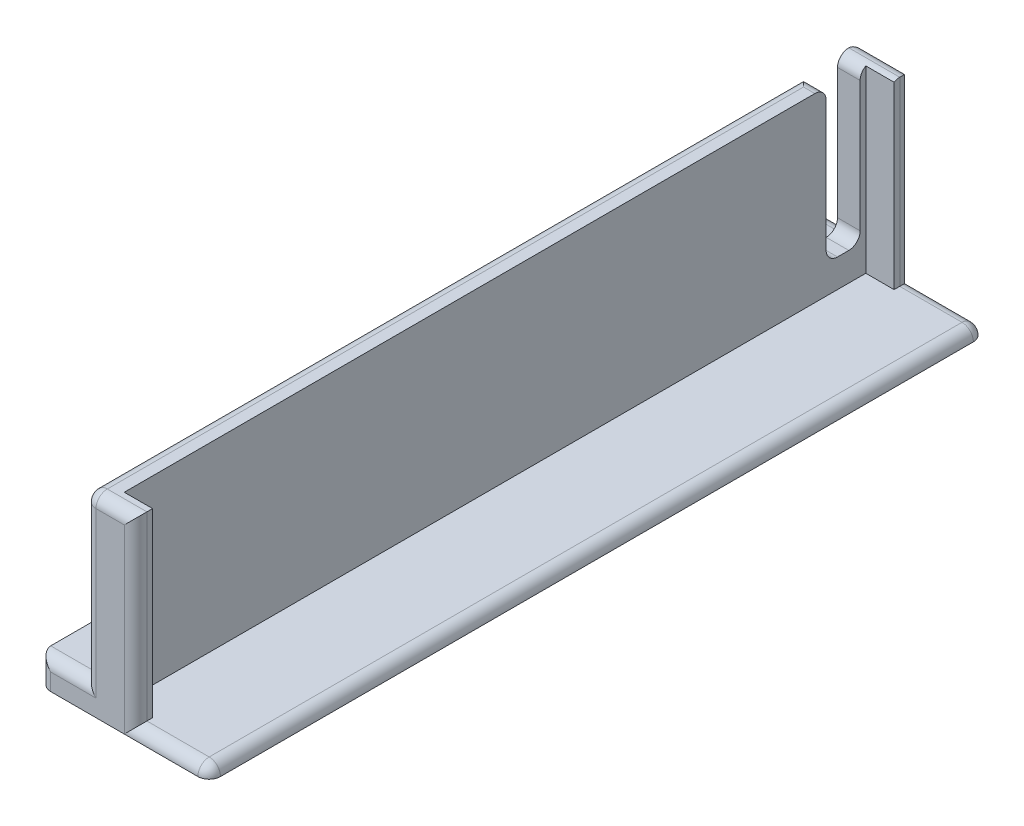
ISO-10303-21;
HEADER;
FILE_DESCRIPTION(('STEP AP214'),'2;1');
FILE_NAME('part.step','',(''),(''),'','','');
FILE_SCHEMA(('AUTOMOTIVE_DESIGN { 1 0 10303 214 1 1 1 1 }'));
ENDSEC;
DATA;
#1=APPLICATION_CONTEXT('core data for automotive mechanical design processes');
#2=APPLICATION_PROTOCOL_DEFINITION('international standard','automotive_design',2000,#1);
#3=PRODUCT_CONTEXT('',#1,'mechanical');
#4=PRODUCT('Part','Part','',(#3));
#5=PRODUCT_RELATED_PRODUCT_CATEGORY('part','',(#4));
#6=PRODUCT_DEFINITION_FORMATION('','',#4);
#7=PRODUCT_DEFINITION_CONTEXT('part definition',#1,'design');
#8=PRODUCT_DEFINITION('design','',#6,#7);
#9=PRODUCT_DEFINITION_SHAPE('','',#8);
#10=(LENGTH_UNIT() NAMED_UNIT(*) SI_UNIT(.MILLI.,.METRE.));
#11=(NAMED_UNIT(*) PLANE_ANGLE_UNIT() SI_UNIT($,.RADIAN.));
#12=(NAMED_UNIT(*) SI_UNIT($,.STERADIAN.) SOLID_ANGLE_UNIT());
#13=UNCERTAINTY_MEASURE_WITH_UNIT(LENGTH_MEASURE(1.E-05),#10,'distance_accuracy_value','');
#14=(GEOMETRIC_REPRESENTATION_CONTEXT(3) GLOBAL_UNCERTAINTY_ASSIGNED_CONTEXT((#13)) GLOBAL_UNIT_ASSIGNED_CONTEXT((#10,
#11,#12)) REPRESENTATION_CONTEXT('',''));
#15=CARTESIAN_POINT('',(0.,0.,0.));
#16=DIRECTION('',(0.,0.,1.));
#17=DIRECTION('',(1.,0.,0.));
#18=AXIS2_PLACEMENT_3D('',#15,#16,#17);
#19=CARTESIAN_POINT('',(12.,34.,131.));
#20=DIRECTION('',(0.,-1.,0.));
#21=DIRECTION('',(0.,0.,-1.));
#22=AXIS2_PLACEMENT_3D('',#19,#20,#21);
#23=PLANE('',#22);
#24=DIRECTION('',(0.,0.,-1.));
#25=VECTOR('',#24,1.);
#26=CARTESIAN_POINT('',(12.,34.,131.));
#27=LINE('',#26,#25);
#28=CARTESIAN_POINT('',(12.,34.,131.));
#29=VERTEX_POINT('',#28);
#30=CARTESIAN_POINT('',(12.,34.,9.00000000000001));
#31=VERTEX_POINT('',#30);
#32=EDGE_CURVE('E265',#29,#31,#27,.T.);
#33=ORIENTED_EDGE('',*,*,#32,.T.);
#34=DIRECTION('',(1.,0.,0.));
#35=VECTOR('',#34,1.);
#36=CARTESIAN_POINT('',(12.,34.,9.00000000000001));
#37=LINE('',#36,#35);
#38=CARTESIAN_POINT('',(10.,34.,9.));
#39=VERTEX_POINT('',#38);
#40=EDGE_CURVE('E331',#31,#39,#37,.F.);
#41=ORIENTED_EDGE('',*,*,#40,.T.);
#42=DIRECTION('',(0.,0.,-1.));
#43=VECTOR('',#42,1.);
#44=CARTESIAN_POINT('',(10.,34.,131.));
#45=LINE('',#44,#43);
#46=CARTESIAN_POINT('',(10.,34.,132.));
#47=VERTEX_POINT('',#46);
#48=EDGE_CURVE('E328',#39,#47,#45,.F.);
#49=ORIENTED_EDGE('',*,*,#48,.T.);
#50=DIRECTION('',(-1.,0.,0.));
#51=VECTOR('',#50,1.);
#52=CARTESIAN_POINT('',(17.,34.,132.));
#53=LINE('',#52,#51);
#54=CARTESIAN_POINT('',(17.,34.,132.));
#55=VERTEX_POINT('',#54);
#56=EDGE_CURVE('E325',#47,#55,#53,.F.);
#57=ORIENTED_EDGE('',*,*,#56,.T.);
#58=DIRECTION('',(0.,0.,-1.));
#59=VECTOR('',#58,1.);
#60=CARTESIAN_POINT('',(17.,34.,134.));
#61=LINE('',#60,#59);
#62=CARTESIAN_POINT('',(17.,34.,131.));
#63=VERTEX_POINT('',#62);
#64=EDGE_CURVE('E520',#55,#63,#61,.T.);
#65=ORIENTED_EDGE('',*,*,#64,.T.);
#66=DIRECTION('',(-1.,0.,0.));
#67=VECTOR('',#66,1.);
#68=CARTESIAN_POINT('',(8.,34.,131.));
#69=LINE('',#68,#67);
#70=EDGE_CURVE('E513',#63,#29,#69,.T.);
#71=ORIENTED_EDGE('',*,*,#70,.T.);
#72=EDGE_LOOP('',(#33,#41,#49,#57,#65,#71));
#73=FACE_BOUND('',#72,.T.);
#74=ADVANCED_FACE('F39',(#73),#23,.F.);
#75=CARTESIAN_POINT('',(0.,5.,131.));
#76=DIRECTION('',(1.,0.,0.));
#77=DIRECTION('',(0.,0.,-1.));
#78=AXIS2_PLACEMENT_3D('',#75,#76,#77);
#79=PLANE('',#78);
#80=DIRECTION('',(0.,0.,-1.));
#81=VECTOR('',#80,1.);
#82=CARTESIAN_POINT('',(0.,5.,131.));
#83=LINE('',#82,#81);
#84=CARTESIAN_POINT('',(0.,5.,132.));
#85=VERTEX_POINT('',#84);
#86=CARTESIAN_POINT('',(0.,5.,-1.));
#87=VERTEX_POINT('',#86);
#88=EDGE_CURVE('E257',#85,#87,#83,.T.);
#89=ORIENTED_EDGE('',*,*,#88,.T.);
#90=DIRECTION('',(0.,1.,0.));
#91=VECTOR('',#90,1.);
#92=CARTESIAN_POINT('',(0.,0.,-1.));
#93=LINE('',#92,#91);
#94=CARTESIAN_POINT('',(0.,0.,-1.));
#95=VERTEX_POINT('',#94);
#96=EDGE_CURVE('E384',#87,#95,#93,.F.);
#97=ORIENTED_EDGE('',*,*,#96,.T.);
#98=DIRECTION('',(0.,0.,-1.));
#99=VECTOR('',#98,1.);
#100=CARTESIAN_POINT('',(0.,0.,131.));
#101=LINE('',#100,#99);
#102=CARTESIAN_POINT('',(0.,0.,132.));
#103=VERTEX_POINT('',#102);
#104=EDGE_CURVE('E274',#103,#95,#101,.T.);
#105=ORIENTED_EDGE('',*,*,#104,.F.);
#106=DIRECTION('',(0.,-1.,0.));
#107=VECTOR('',#106,1.);
#108=CARTESIAN_POINT('',(0.,5.,132.));
#109=LINE('',#108,#107);
#110=EDGE_CURVE('E381',#103,#85,#109,.F.);
#111=ORIENTED_EDGE('',*,*,#110,.T.);
#112=EDGE_LOOP('',(#89,#97,#105,#111));
#113=FACE_BOUND('',#112,.T.);
#114=ADVANCED_FACE('F652',(#113),#79,.F.);
#115=CARTESIAN_POINT('',(0.,0.,131.));
#116=DIRECTION('',(0.,1.,0.));
#117=DIRECTION('',(0.,0.,1.));
#118=AXIS2_PLACEMENT_3D('',#115,#116,#117);
#119=PLANE('',#118);
#120=CARTESIAN_POINT('',(4.,0.,111.));
#121=DIRECTION('',(0.,1.,0.));
#122=DIRECTION('',(0.,0.,1.));
#123=AXIS2_PLACEMENT_3D('',#120,#121,#122);
#124=CIRCLE('',#123,1.7);
#125=CARTESIAN_POINT('',(4.,0.,112.7));
#126=VERTEX_POINT('',#125);
#127=EDGE_CURVE('E534',#126,#126,#124,.T.);
#128=ORIENTED_EDGE('',*,*,#127,.T.);
#129=EDGE_LOOP('',(#128));
#130=FACE_BOUND('',#129,.T.);
#131=CARTESIAN_POINT('',(4.,0.,20.));
#132=DIRECTION('',(0.,1.,0.));
#133=DIRECTION('',(0.,0.,1.));
#134=AXIS2_PLACEMENT_3D('',#131,#132,#133);
#135=CIRCLE('',#134,1.7);
#136=CARTESIAN_POINT('',(4.,0.,21.7));
#137=VERTEX_POINT('',#136);
#138=EDGE_CURVE('E244',#137,#137,#135,.T.);
#139=ORIENTED_EDGE('',*,*,#138,.T.);
#140=EDGE_LOOP('',(#139));
#141=FACE_BOUND('',#140,.T.);
#142=ORIENTED_EDGE('',*,*,#104,.T.);
#143=CARTESIAN_POINT('',(2.,0.,-1.));
#144=DIRECTION('',(0.,1.,0.));
#145=DIRECTION('',(0.,0.,1.));
#146=AXIS2_PLACEMENT_3D('',#143,#144,#145);
#147=CIRCLE('',#146,2.);
#148=CARTESIAN_POINT('',(2.,0.,-3.));
#149=VERTEX_POINT('',#148);
#150=EDGE_CURVE('E395',#95,#149,#147,.F.);
#151=ORIENTED_EDGE('',*,*,#150,.T.);
#152=DIRECTION('',(-1.,0.,0.));
#153=VECTOR('',#152,1.);
#154=CARTESIAN_POINT('',(30.,0.,-3.));
#155=LINE('',#154,#153);
#156=CARTESIAN_POINT('',(15.,0.,-3.));
#157=VERTEX_POINT('',#156);
#158=EDGE_CURVE('E237',#157,#149,#155,.T.);
#159=ORIENTED_EDGE('',*,*,#158,.F.);
#160=CARTESIAN_POINT('',(28.,0.,-3.));
#161=VERTEX_POINT('',#160);
#162=EDGE_CURVE('E227',#161,#157,#155,.T.);
#163=ORIENTED_EDGE('',*,*,#162,.F.);
#164=CARTESIAN_POINT('',(28.,0.,-1.));
#165=DIRECTION('',(0.,1.,0.));
#166=DIRECTION('',(0.,0.,1.));
#167=AXIS2_PLACEMENT_3D('',#164,#165,#166);
#168=CIRCLE('',#167,2.);
#169=CARTESIAN_POINT('',(30.,0.,-1.));
#170=VERTEX_POINT('',#169);
#171=EDGE_CURVE('E57',#161,#170,#168,.F.);
#172=ORIENTED_EDGE('',*,*,#171,.T.);
#173=DIRECTION('',(0.,0.,-1.));
#174=VECTOR('',#173,1.);
#175=CARTESIAN_POINT('',(30.,0.,131.));
#176=LINE('',#175,#174);
#177=CARTESIAN_POINT('',(30.,0.,132.));
#178=VERTEX_POINT('',#177);
#179=EDGE_CURVE('E61',#178,#170,#176,.T.);
#180=ORIENTED_EDGE('',*,*,#179,.F.);
#181=CARTESIAN_POINT('',(28.,0.,132.));
#182=DIRECTION('',(0.,1.,0.));
#183=DIRECTION('',(0.,0.,1.));
#184=AXIS2_PLACEMENT_3D('',#181,#182,#183);
#185=CIRCLE('',#184,2.);
#186=CARTESIAN_POINT('',(28.,0.,134.));
#187=VERTEX_POINT('',#186);
#188=EDGE_CURVE('E387',#178,#187,#185,.F.);
#189=ORIENTED_EDGE('',*,*,#188,.T.);
#190=DIRECTION('',(1.,0.,0.));
#191=VECTOR('',#190,1.);
#192=CARTESIAN_POINT('',(0.,0.,134.));
#193=LINE('',#192,#191);
#194=CARTESIAN_POINT('',(15.,0.,134.));
#195=VERTEX_POINT('',#194);
#196=EDGE_CURVE('E508',#195,#187,#193,.T.);
#197=ORIENTED_EDGE('',*,*,#196,.F.);
#198=CARTESIAN_POINT('',(2.,0.,134.));
#199=VERTEX_POINT('',#198);
#200=EDGE_CURVE('E512',#199,#195,#193,.T.);
#201=ORIENTED_EDGE('',*,*,#200,.F.);
#202=CARTESIAN_POINT('',(2.,0.,132.));
#203=DIRECTION('',(0.,1.,0.));
#204=DIRECTION('',(0.,0.,1.));
#205=AXIS2_PLACEMENT_3D('',#202,#203,#204);
#206=CIRCLE('',#205,2.);
#207=EDGE_CURVE('E392',#199,#103,#206,.F.);
#208=ORIENTED_EDGE('',*,*,#207,.T.);
#209=EDGE_LOOP('',(#142,#151,#159,#163,#172,#180,#189,#197,#201,#208));
#210=FACE_BOUND('',#209,.T.);
#211=ADVANCED_FACE('F654',(#130,#141,#210),#119,.F.);
#212=CARTESIAN_POINT('',(30.,2.,131.));
#213=DIRECTION('',(0.,-1.,0.));
#214=DIRECTION('',(1.,0.,0.));
#215=AXIS2_PLACEMENT_3D('',#212,#213,#214);
#216=PLANE('',#215);
#217=DIRECTION('',(0.,0.,-1.));
#218=VECTOR('',#217,1.);
#219=CARTESIAN_POINT('',(28.,2.,131.));
#220=LINE('',#219,#218);
#221=CARTESIAN_POINT('',(28.,2.,132.));
#222=VERTEX_POINT('',#221);
#223=CARTESIAN_POINT('',(28.,2.,-1.));
#224=VERTEX_POINT('',#223);
#225=EDGE_CURVE('E373',#222,#224,#220,.T.);
#226=ORIENTED_EDGE('',*,*,#225,.T.);
#227=DIRECTION('',(1.,0.,0.));
#228=VECTOR('',#227,1.);
#229=CARTESIAN_POINT('',(17.,2.,-1.));
#230=LINE('',#229,#228);
#231=CARTESIAN_POINT('',(17.,2.,-1.));
#232=VERTEX_POINT('',#231);
#233=EDGE_CURVE('E222',#224,#232,#230,.F.);
#234=ORIENTED_EDGE('',*,*,#233,.T.);
#235=DIRECTION('',(0.,0.,1.));
#236=VECTOR('',#235,1.);
#237=CARTESIAN_POINT('',(17.,2.,-3.));
#238=LINE('',#237,#236);
#239=CARTESIAN_POINT('',(17.,2.,0.));
#240=VERTEX_POINT('',#239);
#241=EDGE_CURVE('E215',#232,#240,#238,.T.);
#242=ORIENTED_EDGE('',*,*,#241,.T.);
#243=DIRECTION('',(-1.,0.,0.));
#244=VECTOR('',#243,1.);
#245=CARTESIAN_POINT('',(30.,2.,0.));
#246=LINE('',#245,#244);
#247=CARTESIAN_POINT('',(12.,2.,0.));
#248=VERTEX_POINT('',#247);
#249=EDGE_CURVE('E219',#240,#248,#246,.T.);
#250=ORIENTED_EDGE('',*,*,#249,.T.);
#251=DIRECTION('',(0.,0.,-1.));
#252=VECTOR('',#251,1.);
#253=CARTESIAN_POINT('',(12.,2.,131.));
#254=LINE('',#253,#252);
#255=CARTESIAN_POINT('',(12.,2.,131.));
#256=VERTEX_POINT('',#255);
#257=EDGE_CURVE('E269',#256,#248,#254,.T.);
#258=ORIENTED_EDGE('',*,*,#257,.F.);
#259=DIRECTION('',(-1.,0.,0.));
#260=VECTOR('',#259,1.);
#261=CARTESIAN_POINT('',(30.,2.,131.));
#262=LINE('',#261,#260);
#263=CARTESIAN_POINT('',(17.,2.,131.));
#264=VERTEX_POINT('',#263);
#265=EDGE_CURVE('E248',#264,#256,#262,.T.);
#266=ORIENTED_EDGE('',*,*,#265,.F.);
#267=DIRECTION('',(0.,0.,-1.));
#268=VECTOR('',#267,1.);
#269=CARTESIAN_POINT('',(17.,2.,134.));
#270=LINE('',#269,#268);
#271=CARTESIAN_POINT('',(17.,2.,132.));
#272=VERTEX_POINT('',#271);
#273=EDGE_CURVE('E523',#272,#264,#270,.T.);
#274=ORIENTED_EDGE('',*,*,#273,.F.);
#275=DIRECTION('',(-1.,0.,0.));
#276=VECTOR('',#275,1.);
#277=CARTESIAN_POINT('',(30.,2.,132.));
#278=LINE('',#277,#276);
#279=EDGE_CURVE('E376',#272,#222,#278,.F.);
#280=ORIENTED_EDGE('',*,*,#279,.T.);
#281=EDGE_LOOP('',(#226,#234,#242,#250,#258,#266,#274,#280));
#282=FACE_BOUND('',#281,.T.);
#283=ADVANCED_FACE('F217',(#282),#216,.F.);
#284=CARTESIAN_POINT('',(12.,2.,131.));
#285=DIRECTION('',(-1.,0.,0.));
#286=DIRECTION('',(0.,0.,1.));
#287=AXIS2_PLACEMENT_3D('',#284,#285,#286);
#288=PLANE('',#287);
#289=DIRECTION('',(0.,1.,0.));
#290=VECTOR('',#289,1.);
#291=CARTESIAN_POINT('',(12.,2.,0.));
#292=LINE('',#291,#290);
#293=CARTESIAN_POINT('',(12.,33.7320508075689,0.));
#294=VERTEX_POINT('',#293);
#295=EDGE_CURVE('E242',#248,#294,#292,.T.);
#296=ORIENTED_EDGE('',*,*,#295,.T.);
#297=CARTESIAN_POINT('',(12.,32.,-1.));
#298=DIRECTION('',(-1.,0.,0.));
#299=DIRECTION('',(0.,0.,1.));
#300=AXIS2_PLACEMENT_3D('',#297,#298,#299);
#301=CIRCLE('',#300,2.);
#302=CARTESIAN_POINT('',(12.,32.,1.));
#303=VERTEX_POINT('',#302);
#304=EDGE_CURVE('E310',#294,#303,#301,.F.);
#305=ORIENTED_EDGE('',*,*,#304,.T.);
#306=DIRECTION('',(0.,1.,0.));
#307=VECTOR('',#306,1.);
#308=CARTESIAN_POINT('',(12.,34.,1.));
#309=LINE('',#308,#307);
#310=CARTESIAN_POINT('',(12.,9.,0.999999999999997));
#311=VERTEX_POINT('',#310);
#312=EDGE_CURVE('E492',#311,#303,#309,.T.);
#313=ORIENTED_EDGE('',*,*,#312,.F.);
#314=CARTESIAN_POINT('',(12.,9.,3.));
#315=DIRECTION('',(-1.,0.,0.));
#316=DIRECTION('',(0.,0.,1.));
#317=AXIS2_PLACEMENT_3D('',#314,#315,#316);
#318=CIRCLE('',#317,2.);
#319=CARTESIAN_POINT('',(12.,7.,3.));
#320=VERTEX_POINT('',#319);
#321=EDGE_CURVE('E398',#311,#320,#318,.T.);
#322=ORIENTED_EDGE('',*,*,#321,.T.);
#323=DIRECTION('',(0.,0.,-1.));
#324=VECTOR('',#323,1.);
#325=CARTESIAN_POINT('',(12.,7.,7.));
#326=LINE('',#325,#324);
#327=CARTESIAN_POINT('',(12.,7.,5.));
#328=VERTEX_POINT('',#327);
#329=EDGE_CURVE('E485',#328,#320,#326,.T.);
#330=ORIENTED_EDGE('',*,*,#329,.F.);
#331=CARTESIAN_POINT('',(12.,9.,5.));
#332=DIRECTION('',(-1.,0.,0.));
#333=DIRECTION('',(0.,0.,1.));
#334=AXIS2_PLACEMENT_3D('',#331,#332,#333);
#335=CIRCLE('',#334,2.);
#336=CARTESIAN_POINT('',(12.,9.,7.));
#337=VERTEX_POINT('',#336);
#338=EDGE_CURVE('E49',#328,#337,#335,.T.);
#339=ORIENTED_EDGE('',*,*,#338,.T.);
#340=DIRECTION('',(0.,-1.,0.));
#341=VECTOR('',#340,1.);
#342=CARTESIAN_POINT('',(12.,34.,7.));
#343=LINE('',#342,#341);
#344=CARTESIAN_POINT('',(12.,32.,7.));
#345=VERTEX_POINT('',#344);
#346=EDGE_CURVE('E478',#345,#337,#343,.T.);
#347=ORIENTED_EDGE('',*,*,#346,.F.);
#348=CARTESIAN_POINT('',(12.,32.,9.));
#349=DIRECTION('',(-1.,0.,0.));
#350=DIRECTION('',(0.,0.,1.));
#351=AXIS2_PLACEMENT_3D('',#348,#349,#350);
#352=CIRCLE('',#351,2.);
#353=EDGE_CURVE('E307',#345,#31,#352,.F.);
#354=ORIENTED_EDGE('',*,*,#353,.T.);
#355=ORIENTED_EDGE('',*,*,#32,.F.);
#356=DIRECTION('',(0.,1.,0.));
#357=VECTOR('',#356,1.);
#358=CARTESIAN_POINT('',(12.,2.,131.));
#359=LINE('',#358,#357);
#360=EDGE_CURVE('E254',#256,#29,#359,.T.);
#361=ORIENTED_EDGE('',*,*,#360,.F.);
#362=ORIENTED_EDGE('',*,*,#257,.T.);
#363=EDGE_LOOP('',(#296,#305,#313,#322,#330,#339,#347,#354,#355,#361,#362));
#364=FACE_BOUND('',#363,.T.);
#365=ADVANCED_FACE('F565',(#364),#288,.F.);
#366=CARTESIAN_POINT('',(8.,34.,131.));
#367=DIRECTION('',(1.,0.,0.));
#368=DIRECTION('',(0.,1.,0.));
#369=AXIS2_PLACEMENT_3D('',#366,#367,#368);
#370=PLANE('',#369);
#371=DIRECTION('',(0.,-1.,0.));
#372=VECTOR('',#371,1.);
#373=CARTESIAN_POINT('',(8.,34.,1.));
#374=LINE('',#373,#372);
#375=CARTESIAN_POINT('',(8.,32.,1.));
#376=VERTEX_POINT('',#375);
#377=CARTESIAN_POINT('',(8.,9.,0.999999999999997));
#378=VERTEX_POINT('',#377);
#379=EDGE_CURVE('E501',#376,#378,#374,.T.);
#380=ORIENTED_EDGE('',*,*,#379,.F.);
#381=CARTESIAN_POINT('',(8.,32.,-1.));
#382=DIRECTION('',(1.,0.,0.));
#383=DIRECTION('',(0.,1.,0.));
#384=AXIS2_PLACEMENT_3D('',#381,#382,#383);
#385=CIRCLE('',#384,2.);
#386=CARTESIAN_POINT('',(8.,34.,-1.));
#387=VERTEX_POINT('',#386);
#388=EDGE_CURVE('E322',#376,#387,#385,.F.);
#389=ORIENTED_EDGE('',*,*,#388,.T.);
#390=DIRECTION('',(0.,1.,0.));
#391=VECTOR('',#390,1.);
#392=CARTESIAN_POINT('',(8.,5.,-1.));
#393=LINE('',#392,#391);
#394=CARTESIAN_POINT('',(8.,5.,-1.));
#395=VERTEX_POINT('',#394);
#396=EDGE_CURVE('E319',#387,#395,#393,.F.);
#397=ORIENTED_EDGE('',*,*,#396,.T.);
#398=DIRECTION('',(0.,0.,-1.));
#399=VECTOR('',#398,1.);
#400=CARTESIAN_POINT('',(8.,5.,131.));
#401=LINE('',#400,#399);
#402=CARTESIAN_POINT('',(8.,5.,132.));
#403=VERTEX_POINT('',#402);
#404=EDGE_CURVE('E261',#403,#395,#401,.T.);
#405=ORIENTED_EDGE('',*,*,#404,.F.);
#406=DIRECTION('',(0.,-1.,0.));
#407=VECTOR('',#406,1.);
#408=CARTESIAN_POINT('',(8.,34.,132.));
#409=LINE('',#408,#407);
#410=CARTESIAN_POINT('',(8.,32.,132.));
#411=VERTEX_POINT('',#410);
#412=EDGE_CURVE('E313',#403,#411,#409,.F.);
#413=ORIENTED_EDGE('',*,*,#412,.T.);
#414=DIRECTION('',(0.,0.,-1.));
#415=VECTOR('',#414,1.);
#416=CARTESIAN_POINT('',(8.,32.,131.));
#417=LINE('',#416,#415);
#418=CARTESIAN_POINT('',(8.,32.,7.));
#419=VERTEX_POINT('',#418);
#420=EDGE_CURVE('E316',#411,#419,#417,.T.);
#421=ORIENTED_EDGE('',*,*,#420,.T.);
#422=DIRECTION('',(0.,1.,0.));
#423=VECTOR('',#422,1.);
#424=CARTESIAN_POINT('',(8.,34.,7.));
#425=LINE('',#424,#423);
#426=CARTESIAN_POINT('',(8.,9.,7.));
#427=VERTEX_POINT('',#426);
#428=EDGE_CURVE('E495',#427,#419,#425,.T.);
#429=ORIENTED_EDGE('',*,*,#428,.F.);
#430=CARTESIAN_POINT('',(8.,9.,5.));
#431=DIRECTION('',(1.,0.,0.));
#432=DIRECTION('',(0.,1.,0.));
#433=AXIS2_PLACEMENT_3D('',#430,#431,#432);
#434=CIRCLE('',#433,2.);
#435=CARTESIAN_POINT('',(8.,7.,5.));
#436=VERTEX_POINT('',#435);
#437=EDGE_CURVE('E11',#427,#436,#434,.T.);
#438=ORIENTED_EDGE('',*,*,#437,.T.);
#439=DIRECTION('',(0.,0.,1.));
#440=VECTOR('',#439,1.);
#441=CARTESIAN_POINT('',(8.,7.,7.));
#442=LINE('',#441,#440);
#443=CARTESIAN_POINT('',(8.,7.,3.));
#444=VERTEX_POINT('',#443);
#445=EDGE_CURVE('E238',#444,#436,#442,.T.);
#446=ORIENTED_EDGE('',*,*,#445,.F.);
#447=CARTESIAN_POINT('',(8.,9.,3.));
#448=DIRECTION('',(1.,0.,0.));
#449=DIRECTION('',(0.,1.,0.));
#450=AXIS2_PLACEMENT_3D('',#447,#448,#449);
#451=CIRCLE('',#450,2.);
#452=EDGE_CURVE('E401',#444,#378,#451,.T.);
#453=ORIENTED_EDGE('',*,*,#452,.T.);
#454=EDGE_LOOP('',(#380,#389,#397,#405,#413,#421,#429,#438,#446,#453));
#455=FACE_BOUND('',#454,.T.);
#456=ADVANCED_FACE('F577',(#455),#370,.F.);
#457=CARTESIAN_POINT('',(8.,5.,131.));
#458=DIRECTION('',(0.,-1.,0.));
#459=DIRECTION('',(1.,0.,0.));
#460=AXIS2_PLACEMENT_3D('',#457,#458,#459);
#461=PLANE('',#460);
#462=CARTESIAN_POINT('',(4.,5.,111.));
#463=DIRECTION('',(0.,1.,0.));
#464=DIRECTION('',(0.,0.,1.));
#465=AXIS2_PLACEMENT_3D('',#462,#463,#464);
#466=CIRCLE('',#465,3.15);
#467=CARTESIAN_POINT('',(4.,5.,114.15));
#468=VERTEX_POINT('',#467);
#469=EDGE_CURVE('E526',#468,#468,#466,.T.);
#470=ORIENTED_EDGE('',*,*,#469,.F.);
#471=EDGE_LOOP('',(#470));
#472=FACE_BOUND('',#471,.T.);
#473=CARTESIAN_POINT('',(4.,5.,20.));
#474=DIRECTION('',(0.,1.,0.));
#475=DIRECTION('',(0.,0.,1.));
#476=AXIS2_PLACEMENT_3D('',#473,#474,#475);
#477=CIRCLE('',#476,3.15);
#478=CARTESIAN_POINT('',(4.,5.,23.15));
#479=VERTEX_POINT('',#478);
#480=EDGE_CURVE('E538',#479,#479,#477,.T.);
#481=ORIENTED_EDGE('',*,*,#480,.F.);
#482=EDGE_LOOP('',(#481));
#483=FACE_BOUND('',#482,.T.);
#484=ORIENTED_EDGE('',*,*,#404,.T.);
#485=DIRECTION('',(1.,0.,0.));
#486=VECTOR('',#485,1.);
#487=CARTESIAN_POINT('',(0.,5.,-1.));
#488=LINE('',#487,#486);
#489=EDGE_CURVE('E370',#395,#87,#488,.F.);
#490=ORIENTED_EDGE('',*,*,#489,.T.);
#491=ORIENTED_EDGE('',*,*,#88,.F.);
#492=DIRECTION('',(-1.,0.,0.));
#493=VECTOR('',#492,1.);
#494=CARTESIAN_POINT('',(8.,5.,132.));
#495=LINE('',#494,#493);
#496=EDGE_CURVE('E367',#85,#403,#495,.F.);
#497=ORIENTED_EDGE('',*,*,#496,.T.);
#498=EDGE_LOOP('',(#484,#490,#491,#497));
#499=FACE_BOUND('',#498,.T.);
#500=ADVANCED_FACE('F639',(#472,#483,#499),#461,.F.);
#501=CARTESIAN_POINT('',(4.,5.,20.));
#502=DIRECTION('',(0.,1.,0.));
#503=DIRECTION('',(0.,0.,1.));
#504=AXIS2_PLACEMENT_3D('',#501,#502,#503);
#505=CYLINDRICAL_SURFACE('',#504,1.7);
#506=ORIENTED_EDGE('',*,*,#138,.F.);
#507=EDGE_LOOP('',(#506));
#508=FACE_BOUND('',#507,.T.);
#509=CARTESIAN_POINT('',(4.,3.55,20.));
#510=DIRECTION('',(0.,1.,0.));
#511=DIRECTION('',(0.,0.,1.));
#512=AXIS2_PLACEMENT_3D('',#509,#510,#511);
#513=CIRCLE('',#512,1.7);
#514=CARTESIAN_POINT('',(4.,3.55,21.7));
#515=VERTEX_POINT('',#514);
#516=EDGE_CURVE('E251',#515,#515,#513,.T.);
#517=ORIENTED_EDGE('',*,*,#516,.T.);
#518=EDGE_LOOP('',(#517));
#519=FACE_BOUND('',#518,.T.);
#520=ADVANCED_FACE('F809',(#508,#519),#505,.F.);
#521=CARTESIAN_POINT('',(4.,5.,20.));
#522=DIRECTION('',(0.,1.,0.));
#523=DIRECTION('',(0.,0.,1.));
#524=AXIS2_PLACEMENT_3D('',#521,#522,#523);
#525=CONICAL_SURFACE('',#524,3.15,0.785398163397448);
#526=ORIENTED_EDGE('',*,*,#516,.F.);
#527=EDGE_LOOP('',(#526));
#528=FACE_BOUND('',#527,.T.);
#529=ORIENTED_EDGE('',*,*,#480,.T.);
#530=EDGE_LOOP('',(#529));
#531=FACE_BOUND('',#530,.T.);
#532=ADVANCED_FACE('F877',(#528,#531),#525,.F.);
#533=CARTESIAN_POINT('',(4.,5.,111.));
#534=DIRECTION('',(0.,1.,0.));
#535=DIRECTION('',(0.,0.,1.));
#536=AXIS2_PLACEMENT_3D('',#533,#534,#535);
#537=CYLINDRICAL_SURFACE('',#536,1.7);
#538=ORIENTED_EDGE('',*,*,#127,.F.);
#539=EDGE_LOOP('',(#538));
#540=FACE_BOUND('',#539,.T.);
#541=CARTESIAN_POINT('',(4.,3.55,111.));
#542=DIRECTION('',(0.,1.,0.));
#543=DIRECTION('',(0.,0.,1.));
#544=AXIS2_PLACEMENT_3D('',#541,#542,#543);
#545=CIRCLE('',#544,1.7);
#546=CARTESIAN_POINT('',(4.,3.55,112.7));
#547=VERTEX_POINT('',#546);
#548=EDGE_CURVE('E530',#547,#547,#545,.T.);
#549=ORIENTED_EDGE('',*,*,#548,.T.);
#550=EDGE_LOOP('',(#549));
#551=FACE_BOUND('',#550,.T.);
#552=ADVANCED_FACE('F867',(#540,#551),#537,.F.);
#553=CARTESIAN_POINT('',(4.,5.,111.));
#554=DIRECTION('',(0.,1.,0.));
#555=DIRECTION('',(0.,0.,1.));
#556=AXIS2_PLACEMENT_3D('',#553,#554,#555);
#557=CONICAL_SURFACE('',#556,3.15,0.785398163397447);
#558=ORIENTED_EDGE('',*,*,#548,.F.);
#559=EDGE_LOOP('',(#558));
#560=FACE_BOUND('',#559,.T.);
#561=ORIENTED_EDGE('',*,*,#469,.T.);
#562=EDGE_LOOP('',(#561));
#563=FACE_BOUND('',#562,.T.);
#564=ADVANCED_FACE('F859',(#560,#563),#557,.F.);
#565=CARTESIAN_POINT('',(0.,0.,131.));
#566=DIRECTION('',(0.,0.,1.));
#567=DIRECTION('',(1.,0.,0.));
#568=AXIS2_PLACEMENT_3D('',#565,#566,#567);
#569=PLANE('',#568);
#570=DIRECTION('',(0.,1.,0.));
#571=VECTOR('',#570,1.);
#572=CARTESIAN_POINT('',(17.,34.,131.));
#573=LINE('',#572,#571);
#574=EDGE_CURVE('E226',#264,#63,#573,.T.);
#575=ORIENTED_EDGE('',*,*,#574,.F.);
#576=ORIENTED_EDGE('',*,*,#265,.T.);
#577=ORIENTED_EDGE('',*,*,#360,.T.);
#578=ORIENTED_EDGE('',*,*,#70,.F.);
#579=EDGE_LOOP('',(#575,#576,#577,#578));
#580=FACE_BOUND('',#579,.T.);
#581=ADVANCED_FACE('F553',(#580),#569,.F.);
#582=CARTESIAN_POINT('',(17.,34.,134.));
#583=DIRECTION('',(-1.,0.,0.));
#584=DIRECTION('',(0.,-1.,0.));
#585=AXIS2_PLACEMENT_3D('',#582,#583,#584);
#586=PLANE('',#585);
#587=ORIENTED_EDGE('',*,*,#64,.F.);
#588=DIRECTION('',(0.,1.,0.));
#589=VECTOR('',#588,1.);
#590=CARTESIAN_POINT('',(17.,2.,132.));
#591=LINE('',#590,#589);
#592=EDGE_CURVE('E364',#55,#272,#591,.F.);
#593=ORIENTED_EDGE('',*,*,#592,.T.);
#594=ORIENTED_EDGE('',*,*,#273,.T.);
#595=ORIENTED_EDGE('',*,*,#574,.T.);
#596=EDGE_LOOP('',(#587,#593,#594,#595));
#597=FACE_BOUND('',#596,.T.);
#598=ADVANCED_FACE('F561',(#597),#586,.F.);
#599=CARTESIAN_POINT('',(0.,0.,134.));
#600=DIRECTION('',(0.,0.,1.));
#601=DIRECTION('',(1.,0.,0.));
#602=AXIS2_PLACEMENT_3D('',#599,#600,#601);
#603=PLANE('',#602);
#604=ORIENTED_EDGE('',*,*,#200,.T.);
#605=DIRECTION('',(0.,1.,0.));
#606=VECTOR('',#605,1.);
#607=CARTESIAN_POINT('',(15.,34.,134.));
#608=LINE('',#607,#606);
#609=CARTESIAN_POINT('',(15.,32.,134.));
#610=VERTEX_POINT('',#609);
#611=EDGE_CURVE('E361',#195,#610,#608,.T.);
#612=ORIENTED_EDGE('',*,*,#611,.T.);
#613=DIRECTION('',(-1.,0.,0.));
#614=VECTOR('',#613,1.);
#615=CARTESIAN_POINT('',(8.,32.,134.));
#616=LINE('',#615,#614);
#617=CARTESIAN_POINT('',(10.,32.,134.));
#618=VERTEX_POINT('',#617);
#619=EDGE_CURVE('E358',#610,#618,#616,.T.);
#620=ORIENTED_EDGE('',*,*,#619,.T.);
#621=DIRECTION('',(0.,-1.,0.));
#622=VECTOR('',#621,1.);
#623=CARTESIAN_POINT('',(10.,5.,134.));
#624=LINE('',#623,#622);
#625=CARTESIAN_POINT('',(10.,3.,134.));
#626=VERTEX_POINT('',#625);
#627=EDGE_CURVE('E355',#618,#626,#624,.T.);
#628=ORIENTED_EDGE('',*,*,#627,.T.);
#629=DIRECTION('',(-1.,0.,0.));
#630=VECTOR('',#629,1.);
#631=CARTESIAN_POINT('',(0.,3.,134.));
#632=LINE('',#631,#630);
#633=CARTESIAN_POINT('',(2.,3.,134.));
#634=VERTEX_POINT('',#633);
#635=EDGE_CURVE('E349',#626,#634,#632,.T.);
#636=ORIENTED_EDGE('',*,*,#635,.T.);
#637=DIRECTION('',(0.,-1.,0.));
#638=VECTOR('',#637,1.);
#639=CARTESIAN_POINT('',(2.,0.,134.));
#640=LINE('',#639,#638);
#641=EDGE_CURVE('E352',#634,#199,#640,.T.);
#642=ORIENTED_EDGE('',*,*,#641,.T.);
#643=EDGE_LOOP('',(#604,#612,#620,#628,#636,#642));
#644=FACE_BOUND('',#643,.T.);
#645=ADVANCED_FACE('F664',(#644),#603,.T.);
#646=CARTESIAN_POINT('',(17.,34.,-3.));
#647=DIRECTION('',(-1.,0.,0.));
#648=DIRECTION('',(0.,-1.,0.));
#649=AXIS2_PLACEMENT_3D('',#646,#647,#648);
#650=PLANE('',#649);
#651=DIRECTION('',(0.,-1.,0.));
#652=VECTOR('',#651,1.);
#653=CARTESIAN_POINT('',(17.,34.,-1.));
#654=LINE('',#653,#652);
#655=CARTESIAN_POINT('',(17.,34.,-1.));
#656=VERTEX_POINT('',#655);
#657=EDGE_CURVE('E299',#232,#656,#654,.F.);
#658=ORIENTED_EDGE('',*,*,#657,.T.);
#659=CARTESIAN_POINT('',(17.,32.,-1.));
#660=DIRECTION('',(-1.,0.,0.));
#661=DIRECTION('',(0.,-1.,0.));
#662=AXIS2_PLACEMENT_3D('',#659,#660,#661);
#663=CIRCLE('',#662,2.);
#664=CARTESIAN_POINT('',(17.,33.7320508075689,0.));
#665=VERTEX_POINT('',#664);
#666=EDGE_CURVE('E233',#656,#665,#663,.F.);
#667=ORIENTED_EDGE('',*,*,#666,.T.);
#668=DIRECTION('',(0.,-1.,0.));
#669=VECTOR('',#668,1.);
#670=CARTESIAN_POINT('',(17.,34.,0.));
#671=LINE('',#670,#669);
#672=EDGE_CURVE('E230',#665,#240,#671,.T.);
#673=ORIENTED_EDGE('',*,*,#672,.T.);
#674=ORIENTED_EDGE('',*,*,#241,.F.);
#675=EDGE_LOOP('',(#658,#667,#673,#674));
#676=FACE_BOUND('',#675,.T.);
#677=ADVANCED_FACE('F231',(#676),#650,.F.);
#678=CARTESIAN_POINT('',(0.,0.,-3.));
#679=DIRECTION('',(0.,0.,-1.));
#680=DIRECTION('',(-1.,0.,0.));
#681=AXIS2_PLACEMENT_3D('',#678,#679,#680);
#682=PLANE('',#681);
#683=DIRECTION('',(1.,0.,0.));
#684=VECTOR('',#683,1.);
#685=CARTESIAN_POINT('',(17.,32.,-3.));
#686=LINE('',#685,#684);
#687=CARTESIAN_POINT('',(10.,32.,-3.));
#688=VERTEX_POINT('',#687);
#689=CARTESIAN_POINT('',(15.,32.,-3.));
#690=VERTEX_POINT('',#689);
#691=EDGE_CURVE('E343',#688,#690,#686,.T.);
#692=ORIENTED_EDGE('',*,*,#691,.T.);
#693=DIRECTION('',(0.,-1.,0.));
#694=VECTOR('',#693,1.);
#695=CARTESIAN_POINT('',(15.,2.,-3.));
#696=LINE('',#695,#694);
#697=EDGE_CURVE('E346',#690,#157,#696,.T.);
#698=ORIENTED_EDGE('',*,*,#697,.T.);
#699=ORIENTED_EDGE('',*,*,#158,.T.);
#700=DIRECTION('',(0.,1.,0.));
#701=VECTOR('',#700,1.);
#702=CARTESIAN_POINT('',(2.,5.,-3.));
#703=LINE('',#702,#701);
#704=CARTESIAN_POINT('',(2.,3.,-3.));
#705=VERTEX_POINT('',#704);
#706=EDGE_CURVE('E334',#149,#705,#703,.T.);
#707=ORIENTED_EDGE('',*,*,#706,.T.);
#708=DIRECTION('',(1.,0.,0.));
#709=VECTOR('',#708,1.);
#710=CARTESIAN_POINT('',(8.,3.,-3.));
#711=LINE('',#710,#709);
#712=CARTESIAN_POINT('',(10.,3.,-3.));
#713=VERTEX_POINT('',#712);
#714=EDGE_CURVE('E337',#705,#713,#711,.T.);
#715=ORIENTED_EDGE('',*,*,#714,.T.);
#716=DIRECTION('',(0.,1.,0.));
#717=VECTOR('',#716,1.);
#718=CARTESIAN_POINT('',(10.,34.,-3.));
#719=LINE('',#718,#717);
#720=EDGE_CURVE('E340',#713,#688,#719,.T.);
#721=ORIENTED_EDGE('',*,*,#720,.T.);
#722=EDGE_LOOP('',(#692,#698,#699,#707,#715,#721));
#723=FACE_BOUND('',#722,.T.);
#724=ADVANCED_FACE('F673',(#723),#682,.T.);
#725=CARTESIAN_POINT('',(0.,0.,0.));
#726=DIRECTION('',(0.,0.,-1.));
#727=DIRECTION('',(-1.,0.,0.));
#728=AXIS2_PLACEMENT_3D('',#725,#726,#727);
#729=PLANE('',#728);
#730=ORIENTED_EDGE('',*,*,#672,.F.);
#731=DIRECTION('',(1.,0.,0.));
#732=VECTOR('',#731,1.);
#733=CARTESIAN_POINT('',(17.,33.7320508075689,0.));
#734=LINE('',#733,#732);
#735=EDGE_CURVE('E304',#665,#294,#734,.F.);
#736=ORIENTED_EDGE('',*,*,#735,.T.);
#737=ORIENTED_EDGE('',*,*,#295,.F.);
#738=ORIENTED_EDGE('',*,*,#249,.F.);
#739=EDGE_LOOP('',(#730,#736,#737,#738));
#740=FACE_BOUND('',#739,.T.);
#741=ADVANCED_FACE('F240',(#740),#729,.F.);
#742=CARTESIAN_POINT('',(-19.6586333718787,34.,7.));
#743=DIRECTION('',(0.,0.,1.));
#744=DIRECTION('',(0.,-1.,0.));
#745=AXIS2_PLACEMENT_3D('',#742,#743,#744);
#746=PLANE('',#745);
#747=ORIENTED_EDGE('',*,*,#346,.T.);
#748=DIRECTION('',(1.,0.,0.));
#749=VECTOR('',#748,1.);
#750=CARTESIAN_POINT('',(8.,9.,7.));
#751=LINE('',#750,#749);
#752=EDGE_CURVE('E296',#337,#427,#751,.F.);
#753=ORIENTED_EDGE('',*,*,#752,.T.);
#754=ORIENTED_EDGE('',*,*,#428,.T.);
#755=DIRECTION('',(1.,0.,0.));
#756=VECTOR('',#755,1.);
#757=CARTESIAN_POINT('',(-19.6586333718787,32.,7.));
#758=LINE('',#757,#756);
#759=EDGE_CURVE('E293',#419,#345,#758,.T.);
#760=ORIENTED_EDGE('',*,*,#759,.T.);
#761=EDGE_LOOP('',(#747,#753,#754,#760));
#762=FACE_BOUND('',#761,.T.);
#763=ADVANCED_FACE('F586',(#762),#746,.F.);
#764=CARTESIAN_POINT('',(-19.6586333718787,34.,1.));
#765=DIRECTION('',(0.,0.,-1.));
#766=DIRECTION('',(0.,1.,0.));
#767=AXIS2_PLACEMENT_3D('',#764,#765,#766);
#768=PLANE('',#767);
#769=ORIENTED_EDGE('',*,*,#379,.T.);
#770=DIRECTION('',(1.,0.,0.));
#771=VECTOR('',#770,1.);
#772=CARTESIAN_POINT('',(12.,9.,0.999999999999997));
#773=LINE('',#772,#771);
#774=EDGE_CURVE('E282',#378,#311,#773,.T.);
#775=ORIENTED_EDGE('',*,*,#774,.T.);
#776=ORIENTED_EDGE('',*,*,#312,.T.);
#777=DIRECTION('',(1.,0.,0.));
#778=VECTOR('',#777,1.);
#779=CARTESIAN_POINT('',(-19.6586333718787,32.,1.));
#780=LINE('',#779,#778);
#781=EDGE_CURVE('E278',#303,#376,#780,.F.);
#782=ORIENTED_EDGE('',*,*,#781,.T.);
#783=EDGE_LOOP('',(#769,#775,#776,#782));
#784=FACE_BOUND('',#783,.T.);
#785=ADVANCED_FACE('F574',(#784),#768,.F.);
#786=CARTESIAN_POINT('',(-19.6586333718787,7.,7.));
#787=DIRECTION('',(0.,-1.,0.));
#788=DIRECTION('',(0.,0.,-1.));
#789=AXIS2_PLACEMENT_3D('',#786,#787,#788);
#790=PLANE('',#789);
#791=ORIENTED_EDGE('',*,*,#329,.T.);
#792=DIRECTION('',(1.,0.,0.));
#793=VECTOR('',#792,1.);
#794=CARTESIAN_POINT('',(8.,7.,3.));
#795=LINE('',#794,#793);
#796=EDGE_CURVE('E290',#320,#444,#795,.F.);
#797=ORIENTED_EDGE('',*,*,#796,.T.);
#798=ORIENTED_EDGE('',*,*,#445,.T.);
#799=DIRECTION('',(1.,0.,0.));
#800=VECTOR('',#799,1.);
#801=CARTESIAN_POINT('',(12.,7.,5.));
#802=LINE('',#801,#800);
#803=EDGE_CURVE('E286',#436,#328,#802,.T.);
#804=ORIENTED_EDGE('',*,*,#803,.T.);
#805=EDGE_LOOP('',(#791,#797,#798,#804));
#806=FACE_BOUND('',#805,.T.);
#807=ADVANCED_FACE('F697',(#806),#790,.F.);
#808=CARTESIAN_POINT('',(-19.6586333718787,9.,3.));
#809=DIRECTION('',(-1.,0.,0.));
#810=DIRECTION('',(0.,0.,1.));
#811=AXIS2_PLACEMENT_3D('',#808,#809,#810);
#812=CYLINDRICAL_SURFACE('',#811,2.);
#813=ORIENTED_EDGE('',*,*,#452,.F.);
#814=ORIENTED_EDGE('',*,*,#796,.F.);
#815=ORIENTED_EDGE('',*,*,#321,.F.);
#816=ORIENTED_EDGE('',*,*,#774,.F.);
#817=EDGE_LOOP('',(#813,#814,#815,#816));
#818=FACE_BOUND('',#817,.T.);
#819=ADVANCED_FACE('F693',(#818),#812,.F.);
#820=CARTESIAN_POINT('',(-19.6586333718787,9.,5.));
#821=DIRECTION('',(-1.,0.,0.));
#822=DIRECTION('',(0.,0.,1.));
#823=AXIS2_PLACEMENT_3D('',#820,#821,#822);
#824=CYLINDRICAL_SURFACE('',#823,2.);
#825=ORIENTED_EDGE('',*,*,#437,.F.);
#826=ORIENTED_EDGE('',*,*,#752,.F.);
#827=ORIENTED_EDGE('',*,*,#338,.F.);
#828=ORIENTED_EDGE('',*,*,#803,.F.);
#829=EDGE_LOOP('',(#825,#826,#827,#828));
#830=FACE_BOUND('',#829,.T.);
#831=ADVANCED_FACE('F696',(#830),#824,.F.);
#832=CARTESIAN_POINT('',(2.,0.,132.));
#833=DIRECTION('',(0.,1.,0.));
#834=DIRECTION('',(0.,0.,1.));
#835=AXIS2_PLACEMENT_3D('',#832,#833,#834);
#836=CYLINDRICAL_SURFACE('',#835,2.);
#837=ORIENTED_EDGE('',*,*,#207,.F.);
#838=ORIENTED_EDGE('',*,*,#641,.F.);
#839=CARTESIAN_POINT('',(2.,3.,132.));
#840=DIRECTION('',(0.707106781186547,0.707106781186547,0.));
#841=DIRECTION('',(0.707106781186548,-0.707106781186547,0.));
#842=AXIS2_PLACEMENT_3D('',#839,#840,#841);
#843=ELLIPSE('',#842,2.82842712474619,2.);
#844=EDGE_CURVE('E43',#85,#634,#843,.T.);
#845=ORIENTED_EDGE('',*,*,#844,.F.);
#846=ORIENTED_EDGE('',*,*,#110,.F.);
#847=EDGE_LOOP('',(#837,#838,#845,#846));
#848=FACE_BOUND('',#847,.T.);
#849=ADVANCED_FACE('F41',(#848),#836,.T.);
#850=CARTESIAN_POINT('',(0.,3.,132.));
#851=DIRECTION('',(1.,0.,0.));
#852=DIRECTION('',(0.,1.,0.));
#853=AXIS2_PLACEMENT_3D('',#850,#851,#852);
#854=CYLINDRICAL_SURFACE('',#853,2.);
#855=ORIENTED_EDGE('',*,*,#844,.T.);
#856=ORIENTED_EDGE('',*,*,#635,.F.);
#857=CARTESIAN_POINT('',(10.,3.,132.));
#858=DIRECTION('',(0.707106781186547,0.707106781186548,0.));
#859=DIRECTION('',(-0.707106781186548,0.707106781186547,0.));
#860=AXIS2_PLACEMENT_3D('',#857,#858,#859);
#861=ELLIPSE('',#860,2.82842712474619,2.);
#862=EDGE_CURVE('E469',#403,#626,#861,.T.);
#863=ORIENTED_EDGE('',*,*,#862,.F.);
#864=ORIENTED_EDGE('',*,*,#496,.F.);
#865=EDGE_LOOP('',(#855,#856,#863,#864));
#866=FACE_BOUND('',#865,.T.);
#867=ADVANCED_FACE('F661',(#866),#854,.T.);
#868=CARTESIAN_POINT('',(-19.6586333718787,32.,9.));
#869=DIRECTION('',(1.,0.,0.));
#870=DIRECTION('',(0.,0.,-1.));
#871=AXIS2_PLACEMENT_3D('',#868,#869,#870);
#872=CYLINDRICAL_SURFACE('',#871,2.);
#873=ORIENTED_EDGE('',*,*,#353,.F.);
#874=ORIENTED_EDGE('',*,*,#759,.F.);
#875=CARTESIAN_POINT('',(10.,32.,9.00000000000001));
#876=DIRECTION('',(0.707106781186547,0.,-0.707106781186547));
#877=DIRECTION('',(-0.707106781186547,0.,-0.707106781186547));
#878=AXIS2_PLACEMENT_3D('',#875,#876,#877);
#879=ELLIPSE('',#878,2.82842712474619,2.);
#880=EDGE_CURVE('E466',#39,#419,#879,.F.);
#881=ORIENTED_EDGE('',*,*,#880,.F.);
#882=ORIENTED_EDGE('',*,*,#40,.F.);
#883=EDGE_LOOP('',(#873,#874,#881,#882));
#884=FACE_BOUND('',#883,.T.);
#885=ADVANCED_FACE('F591',(#884),#872,.T.);
#886=CARTESIAN_POINT('',(10.,0.,132.));
#887=DIRECTION('',(0.,1.,0.));
#888=DIRECTION('',(-1.,0.,0.));
#889=AXIS2_PLACEMENT_3D('',#886,#887,#888);
#890=CYLINDRICAL_SURFACE('',#889,2.);
#891=ORIENTED_EDGE('',*,*,#862,.T.);
#892=ORIENTED_EDGE('',*,*,#627,.F.);
#893=CARTESIAN_POINT('',(10.,32.,132.));
#894=DIRECTION('',(0.,1.,0.));
#895=DIRECTION('',(0.,0.,1.));
#896=AXIS2_PLACEMENT_3D('',#893,#894,#895);
#897=CIRCLE('',#896,2.);
#898=EDGE_CURVE('E462',#411,#618,#897,.T.);
#899=ORIENTED_EDGE('',*,*,#898,.F.);
#900=ORIENTED_EDGE('',*,*,#412,.F.);
#901=EDGE_LOOP('',(#891,#892,#899,#900));
#902=FACE_BOUND('',#901,.T.);
#903=ADVANCED_FACE('F662',(#902),#890,.T.);
#904=CARTESIAN_POINT('',(10.,32.,131.));
#905=DIRECTION('',(0.,0.,-1.));
#906=DIRECTION('',(-1.,0.,0.));
#907=AXIS2_PLACEMENT_3D('',#904,#905,#906);
#908=CYLINDRICAL_SURFACE('',#907,2.);
#909=ORIENTED_EDGE('',*,*,#880,.T.);
#910=ORIENTED_EDGE('',*,*,#420,.F.);
#911=CARTESIAN_POINT('',(10.,32.,132.));
#912=DIRECTION('',(0.,0.,1.));
#913=DIRECTION('',(1.,0.,0.));
#914=AXIS2_PLACEMENT_3D('',#911,#912,#913);
#915=CIRCLE('',#914,2.);
#916=EDGE_CURVE('E458',#47,#411,#915,.T.);
#917=ORIENTED_EDGE('',*,*,#916,.F.);
#918=ORIENTED_EDGE('',*,*,#48,.F.);
#919=EDGE_LOOP('',(#909,#910,#917,#918));
#920=FACE_BOUND('',#919,.T.);
#921=ADVANCED_FACE('F595',(#920),#908,.T.);
#922=CARTESIAN_POINT('',(10.,32.,132.));
#923=DIRECTION('',(-1.,0.,0.));
#924=DIRECTION('',(0.,0.,1.));
#925=AXIS2_PLACEMENT_3D('',#922,#923,#924);
#926=SPHERICAL_SURFACE('',#925,2.);
#927=ORIENTED_EDGE('',*,*,#916,.T.);
#928=ORIENTED_EDGE('',*,*,#898,.T.);
#929=CARTESIAN_POINT('',(10.,32.,132.));
#930=DIRECTION('',(-1.,0.,0.));
#931=DIRECTION('',(0.,0.,1.));
#932=AXIS2_PLACEMENT_3D('',#929,#930,#931);
#933=CIRCLE('',#932,2.);
#934=EDGE_CURVE('E454',#47,#618,#933,.F.);
#935=ORIENTED_EDGE('',*,*,#934,.F.);
#936=EDGE_LOOP('',(#927,#928,#935));
#937=FACE_BOUND('',#936,.T.);
#938=ADVANCED_FACE('F600',(#937),#926,.T.);
#939=CARTESIAN_POINT('',(0.,32.,132.));
#940=DIRECTION('',(1.,0.,0.));
#941=DIRECTION('',(0.,0.,-1.));
#942=AXIS2_PLACEMENT_3D('',#939,#940,#941);
#943=CYLINDRICAL_SURFACE('',#942,2.);
#944=ORIENTED_EDGE('',*,*,#934,.T.);
#945=ORIENTED_EDGE('',*,*,#619,.F.);
#946=CARTESIAN_POINT('',(15.,32.,132.));
#947=DIRECTION('',(0.707106781186547,-0.707106781186547,0.));
#948=DIRECTION('',(0.707106781186547,0.707106781186548,0.));
#949=AXIS2_PLACEMENT_3D('',#946,#947,#948);
#950=ELLIPSE('',#949,2.82842712474619,2.);
#951=EDGE_CURVE('E450',#55,#610,#950,.T.);
#952=ORIENTED_EDGE('',*,*,#951,.F.);
#953=ORIENTED_EDGE('',*,*,#56,.F.);
#954=EDGE_LOOP('',(#944,#945,#952,#953));
#955=FACE_BOUND('',#954,.T.);
#956=ADVANCED_FACE('F603',(#955),#943,.T.);
#957=CARTESIAN_POINT('',(15.,0.,132.));
#958=DIRECTION('',(0.,-1.,0.));
#959=DIRECTION('',(1.,0.,0.));
#960=AXIS2_PLACEMENT_3D('',#957,#958,#959);
#961=CYLINDRICAL_SURFACE('',#960,2.);
#962=ORIENTED_EDGE('',*,*,#951,.T.);
#963=ORIENTED_EDGE('',*,*,#611,.F.);
#964=CARTESIAN_POINT('',(15.,0.,132.));
#965=DIRECTION('',(0.707106781186548,-0.707106781186547,0.));
#966=DIRECTION('',(-0.707106781186547,-0.707106781186548,0.));
#967=AXIS2_PLACEMENT_3D('',#964,#965,#966);
#968=ELLIPSE('',#967,2.82842712474619,2.);
#969=EDGE_CURVE('E446',#272,#195,#968,.T.);
#970=ORIENTED_EDGE('',*,*,#969,.F.);
#971=ORIENTED_EDGE('',*,*,#592,.F.);
#972=EDGE_LOOP('',(#962,#963,#970,#971));
#973=FACE_BOUND('',#972,.T.);
#974=ADVANCED_FACE('F606',(#973),#961,.T.);
#975=CARTESIAN_POINT('',(0.,0.,132.));
#976=DIRECTION('',(1.,0.,0.));
#977=DIRECTION('',(0.,1.,0.));
#978=AXIS2_PLACEMENT_3D('',#975,#976,#977);
#979=CYLINDRICAL_SURFACE('',#978,2.);
#980=ORIENTED_EDGE('',*,*,#969,.T.);
#981=ORIENTED_EDGE('',*,*,#196,.T.);
#982=CARTESIAN_POINT('',(28.,0.,132.));
#983=DIRECTION('',(1.,0.,0.));
#984=DIRECTION('',(0.,0.,-1.));
#985=AXIS2_PLACEMENT_3D('',#982,#983,#984);
#986=CIRCLE('',#985,2.);
#987=EDGE_CURVE('E442',#222,#187,#986,.T.);
#988=ORIENTED_EDGE('',*,*,#987,.F.);
#989=ORIENTED_EDGE('',*,*,#279,.F.);
#990=EDGE_LOOP('',(#980,#981,#988,#989));
#991=FACE_BOUND('',#990,.T.);
#992=ADVANCED_FACE('F610',(#991),#979,.T.);
#993=CARTESIAN_POINT('',(28.,0.,132.));
#994=DIRECTION('',(0.,0.,1.));
#995=DIRECTION('',(0.,-1.,0.));
#996=AXIS2_PLACEMENT_3D('',#993,#994,#995);
#997=SPHERICAL_SURFACE('',#996,2.);
#998=ORIENTED_EDGE('',*,*,#987,.T.);
#999=ORIENTED_EDGE('',*,*,#188,.F.);
#1000=CARTESIAN_POINT('',(28.,0.,132.));
#1001=DIRECTION('',(0.,0.,1.));
#1002=DIRECTION('',(1.,0.,0.));
#1003=AXIS2_PLACEMENT_3D('',#1000,#1001,#1002);
#1004=CIRCLE('',#1003,2.);
#1005=EDGE_CURVE('E438',#222,#178,#1004,.F.);
#1006=ORIENTED_EDGE('',*,*,#1005,.F.);
#1007=EDGE_LOOP('',(#998,#999,#1006));
#1008=FACE_BOUND('',#1007,.T.);
#1009=ADVANCED_FACE('F720',(#1008),#997,.T.);
#1010=CARTESIAN_POINT('',(28.,0.,131.));
#1011=DIRECTION('',(0.,0.,-1.));
#1012=DIRECTION('',(-1.,0.,0.));
#1013=AXIS2_PLACEMENT_3D('',#1010,#1011,#1012);
#1014=CYLINDRICAL_SURFACE('',#1013,2.);
#1015=ORIENTED_EDGE('',*,*,#1005,.T.);
#1016=ORIENTED_EDGE('',*,*,#179,.T.);
#1017=CARTESIAN_POINT('',(28.,0.,-1.));
#1018=DIRECTION('',(0.,0.,-1.));
#1019=DIRECTION('',(-1.,0.,0.));
#1020=AXIS2_PLACEMENT_3D('',#1017,#1018,#1019);
#1021=CIRCLE('',#1020,2.);
#1022=EDGE_CURVE('E434',#224,#170,#1021,.T.);
#1023=ORIENTED_EDGE('',*,*,#1022,.F.);
#1024=ORIENTED_EDGE('',*,*,#225,.F.);
#1025=EDGE_LOOP('',(#1015,#1016,#1023,#1024));
#1026=FACE_BOUND('',#1025,.T.);
#1027=ADVANCED_FACE('F616',(#1026),#1014,.T.);
#1028=CARTESIAN_POINT('',(2.,0.,-1.));
#1029=DIRECTION('',(0.,-1.,0.));
#1030=DIRECTION('',(0.,0.,-1.));
#1031=AXIS2_PLACEMENT_3D('',#1028,#1029,#1030);
#1032=CYLINDRICAL_SURFACE('',#1031,2.);
#1033=ORIENTED_EDGE('',*,*,#150,.F.);
#1034=ORIENTED_EDGE('',*,*,#96,.F.);
#1035=CARTESIAN_POINT('',(2.,3.,-1.));
#1036=DIRECTION('',(-0.707106781186547,-0.707106781186547,0.));
#1037=DIRECTION('',(0.707106781186548,-0.707106781186547,0.));
#1038=AXIS2_PLACEMENT_3D('',#1035,#1036,#1037);
#1039=ELLIPSE('',#1038,2.82842712474619,2.);
#1040=EDGE_CURVE('E430',#705,#87,#1039,.F.);
#1041=ORIENTED_EDGE('',*,*,#1040,.F.);
#1042=ORIENTED_EDGE('',*,*,#706,.F.);
#1043=EDGE_LOOP('',(#1033,#1034,#1041,#1042));
#1044=FACE_BOUND('',#1043,.T.);
#1045=ADVANCED_FACE('F649',(#1044),#1032,.T.);
#1046=CARTESIAN_POINT('',(28.,0.,-1.));
#1047=DIRECTION('',(1.,0.,0.));
#1048=DIRECTION('',(0.,0.,-1.));
#1049=AXIS2_PLACEMENT_3D('',#1046,#1047,#1048);
#1050=SPHERICAL_SURFACE('',#1049,2.);
#1051=ORIENTED_EDGE('',*,*,#1022,.T.);
#1052=ORIENTED_EDGE('',*,*,#171,.F.);
#1053=CARTESIAN_POINT('',(28.,0.,-1.));
#1054=DIRECTION('',(1.,0.,0.));
#1055=DIRECTION('',(0.,0.,-1.));
#1056=AXIS2_PLACEMENT_3D('',#1053,#1054,#1055);
#1057=CIRCLE('',#1056,2.);
#1058=EDGE_CURVE('E426',#224,#161,#1057,.F.);
#1059=ORIENTED_EDGE('',*,*,#1058,.F.);
#1060=EDGE_LOOP('',(#1051,#1052,#1059));
#1061=FACE_BOUND('',#1060,.T.);
#1062=ADVANCED_FACE('F618',(#1061),#1050,.T.);
#1063=CARTESIAN_POINT('',(0.,3.,-1.));
#1064=DIRECTION('',(-1.,0.,0.));
#1065=DIRECTION('',(0.,-1.,0.));
#1066=AXIS2_PLACEMENT_3D('',#1063,#1064,#1065);
#1067=CYLINDRICAL_SURFACE('',#1066,2.);
#1068=ORIENTED_EDGE('',*,*,#1040,.T.);
#1069=ORIENTED_EDGE('',*,*,#489,.F.);
#1070=CARTESIAN_POINT('',(10.,3.,-1.));
#1071=DIRECTION('',(-0.707106781186547,-0.707106781186548,0.));
#1072=DIRECTION('',(0.707106781186548,-0.707106781186547,0.));
#1073=AXIS2_PLACEMENT_3D('',#1070,#1071,#1072);
#1074=ELLIPSE('',#1073,2.82842712474619,2.);
#1075=EDGE_CURVE('E422',#713,#395,#1074,.F.);
#1076=ORIENTED_EDGE('',*,*,#1075,.F.);
#1077=ORIENTED_EDGE('',*,*,#714,.F.);
#1078=EDGE_LOOP('',(#1068,#1069,#1076,#1077));
#1079=FACE_BOUND('',#1078,.T.);
#1080=ADVANCED_FACE('F642',(#1079),#1067,.T.);
#1081=CARTESIAN_POINT('',(0.,0.,-1.));
#1082=DIRECTION('',(-1.,0.,0.));
#1083=DIRECTION('',(0.,-1.,0.));
#1084=AXIS2_PLACEMENT_3D('',#1081,#1082,#1083);
#1085=CYLINDRICAL_SURFACE('',#1084,2.);
#1086=ORIENTED_EDGE('',*,*,#1058,.T.);
#1087=ORIENTED_EDGE('',*,*,#162,.T.);
#1088=CARTESIAN_POINT('',(15.,0.,-1.));
#1089=DIRECTION('',(-0.707106781186547,0.707106781186547,0.));
#1090=DIRECTION('',(0.707106781186547,0.707106781186548,0.));
#1091=AXIS2_PLACEMENT_3D('',#1088,#1089,#1090);
#1092=ELLIPSE('',#1091,2.82842712474619,2.);
#1093=EDGE_CURVE('E418',#232,#157,#1092,.T.);
#1094=ORIENTED_EDGE('',*,*,#1093,.F.);
#1095=ORIENTED_EDGE('',*,*,#233,.F.);
#1096=EDGE_LOOP('',(#1086,#1087,#1094,#1095));
#1097=FACE_BOUND('',#1096,.T.);
#1098=ADVANCED_FACE('F621',(#1097),#1085,.T.);
#1099=CARTESIAN_POINT('',(10.,0.,-1.));
#1100=DIRECTION('',(0.,-1.,0.));
#1101=DIRECTION('',(1.,0.,0.));
#1102=AXIS2_PLACEMENT_3D('',#1099,#1100,#1101);
#1103=CYLINDRICAL_SURFACE('',#1102,2.);
#1104=ORIENTED_EDGE('',*,*,#1075,.T.);
#1105=ORIENTED_EDGE('',*,*,#396,.F.);
#1106=CARTESIAN_POINT('',(10.,32.,-1.));
#1107=DIRECTION('',(-0.707106781186547,-0.707106781186548,0.));
#1108=DIRECTION('',(-0.707106781186548,0.707106781186547,0.));
#1109=AXIS2_PLACEMENT_3D('',#1106,#1107,#1108);
#1110=ELLIPSE('',#1109,2.82842712474619,2.);
#1111=EDGE_CURVE('E414',#688,#387,#1110,.F.);
#1112=ORIENTED_EDGE('',*,*,#1111,.F.);
#1113=ORIENTED_EDGE('',*,*,#720,.F.);
#1114=EDGE_LOOP('',(#1104,#1105,#1112,#1113));
#1115=FACE_BOUND('',#1114,.T.);
#1116=ADVANCED_FACE('F634',(#1115),#1103,.T.);
#1117=CARTESIAN_POINT('',(15.,0.,-1.));
#1118=DIRECTION('',(0.,1.,0.));
#1119=DIRECTION('',(-1.,0.,0.));
#1120=AXIS2_PLACEMENT_3D('',#1117,#1118,#1119);
#1121=CYLINDRICAL_SURFACE('',#1120,2.);
#1122=ORIENTED_EDGE('',*,*,#1093,.T.);
#1123=ORIENTED_EDGE('',*,*,#697,.F.);
#1124=CARTESIAN_POINT('',(15.,32.,-1.));
#1125=DIRECTION('',(-0.707106781186547,0.707106781186548,0.));
#1126=DIRECTION('',(-0.707106781186547,-0.707106781186547,0.));
#1127=AXIS2_PLACEMENT_3D('',#1124,#1125,#1126);
#1128=ELLIPSE('',#1127,2.82842712474619,2.);
#1129=EDGE_CURVE('E410',#656,#690,#1128,.T.);
#1130=ORIENTED_EDGE('',*,*,#1129,.F.);
#1131=ORIENTED_EDGE('',*,*,#657,.F.);
#1132=EDGE_LOOP('',(#1122,#1123,#1130,#1131));
#1133=FACE_BOUND('',#1132,.T.);
#1134=ADVANCED_FACE('F626',(#1133),#1121,.T.);
#1135=CARTESIAN_POINT('',(0.,32.,-1.));
#1136=DIRECTION('',(-1.,0.,0.));
#1137=DIRECTION('',(0.,0.,1.));
#1138=AXIS2_PLACEMENT_3D('',#1135,#1136,#1137);
#1139=CYLINDRICAL_SURFACE('',#1138,2.);
#1140=ORIENTED_EDGE('',*,*,#691,.F.);
#1141=ORIENTED_EDGE('',*,*,#1111,.T.);
#1142=DIRECTION('',(1.,0.,0.));
#1143=VECTOR('',#1142,1.);
#1144=CARTESIAN_POINT('',(8.,34.,-1.));
#1145=LINE('',#1144,#1143);
#1146=EDGE_CURVE('E406',#656,#387,#1145,.F.);
#1147=ORIENTED_EDGE('',*,*,#1146,.F.);
#1148=ORIENTED_EDGE('',*,*,#1129,.T.);
#1149=EDGE_LOOP('',(#1140,#1141,#1147,#1148));
#1150=FACE_BOUND('',#1149,.T.);
#1151=ADVANCED_FACE('F630',(#1150),#1139,.T.);
#1152=CARTESIAN_POINT('',(12.,32.,-1.));
#1153=DIRECTION('',(1.,0.,0.));
#1154=DIRECTION('',(0.,0.,-1.));
#1155=AXIS2_PLACEMENT_3D('',#1152,#1153,#1154);
#1156=CYLINDRICAL_SURFACE('',#1155,2.);
#1157=ORIENTED_EDGE('',*,*,#388,.F.);
#1158=ORIENTED_EDGE('',*,*,#781,.F.);
#1159=ORIENTED_EDGE('',*,*,#304,.F.);
#1160=ORIENTED_EDGE('',*,*,#735,.F.);
#1161=ORIENTED_EDGE('',*,*,#666,.F.);
#1162=ORIENTED_EDGE('',*,*,#1146,.T.);
#1163=EDGE_LOOP('',(#1157,#1158,#1159,#1160,#1161,#1162));
#1164=FACE_BOUND('',#1163,.T.);
#1165=ADVANCED_FACE('F570',(#1164),#1156,.T.);
#1166=CLOSED_SHELL('',(#74,#114,#211,#283,#365,#456,#500,#520,#532,#552,#564,#581,#598,#645,
#677,#724,#741,#763,#785,#807,#819,#831,#849,#867,#885,#903,#921,#938,#956,#974,#992,#1009,
#1027,#1045,#1062,#1080,#1098,#1116,#1134,#1151,#1165));
#1167=MANIFOLD_SOLID_BREP('B2',#1166);
#1168=ADVANCED_BREP_SHAPE_REPRESENTATION('',(#18,#1167),#14);
#1169=SHAPE_DEFINITION_REPRESENTATION(#9,#1168);
ENDSEC;
END-ISO-10303-21;
